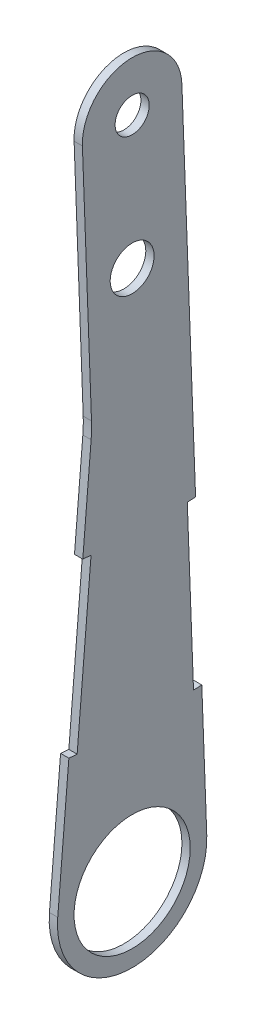
ISO-10303-21;
HEADER;
FILE_DESCRIPTION(('STEP AP214'),'2;1');
FILE_NAME('part.step','',(''),(''),'','','');
FILE_SCHEMA(('AUTOMOTIVE_DESIGN { 1 0 10303 214 1 1 1 1 }'));
ENDSEC;
DATA;
#1=APPLICATION_CONTEXT('core data for automotive mechanical design processes');
#2=APPLICATION_PROTOCOL_DEFINITION('international standard','automotive_design',2000,#1);
#3=PRODUCT_CONTEXT('',#1,'mechanical');
#4=PRODUCT('Part','Part','',(#3));
#5=PRODUCT_RELATED_PRODUCT_CATEGORY('part','',(#4));
#6=PRODUCT_DEFINITION_FORMATION('','',#4);
#7=PRODUCT_DEFINITION_CONTEXT('part definition',#1,'design');
#8=PRODUCT_DEFINITION('design','',#6,#7);
#9=PRODUCT_DEFINITION_SHAPE('','',#8);
#10=(LENGTH_UNIT() NAMED_UNIT(*) SI_UNIT(.MILLI.,.METRE.));
#11=(NAMED_UNIT(*) PLANE_ANGLE_UNIT() SI_UNIT($,.RADIAN.));
#12=(NAMED_UNIT(*) SI_UNIT($,.STERADIAN.) SOLID_ANGLE_UNIT());
#13=UNCERTAINTY_MEASURE_WITH_UNIT(LENGTH_MEASURE(1.E-05),#10,'distance_accuracy_value','');
#14=(GEOMETRIC_REPRESENTATION_CONTEXT(3) GLOBAL_UNCERTAINTY_ASSIGNED_CONTEXT((#13)) GLOBAL_UNIT_ASSIGNED_CONTEXT((#10,
#11,#12)) REPRESENTATION_CONTEXT('',''));
#15=CARTESIAN_POINT('',(0.,0.,0.));
#16=DIRECTION('',(0.,0.,1.));
#17=DIRECTION('',(1.,0.,0.));
#18=AXIS2_PLACEMENT_3D('',#15,#16,#17);
#19=CARTESIAN_POINT('',(1.5875,79.2595794387611,33.1580566897508));
#20=DIRECTION('',(-1.,0.,0.));
#21=DIRECTION('',(0.,0.,1.));
#22=AXIS2_PLACEMENT_3D('',#19,#20,#21);
#23=CYLINDRICAL_SURFACE('',#22,25.4);
#24=CARTESIAN_POINT('',(0.,79.2595794387611,33.1580566897508));
#25=DIRECTION('',(1.,0.,0.));
#26=DIRECTION('',(0.,0.,-1.));
#27=AXIS2_PLACEMENT_3D('',#24,#25,#26);
#28=CIRCLE('',#27,25.4);
#29=CARTESIAN_POINT('',(0.,77.1296906583665,7.84751394995261));
#30=VERTEX_POINT('',#29);
#31=CARTESIAN_POINT('',(0.,80.2120794387611,7.77592234785588));
#32=VERTEX_POINT('',#31);
#33=EDGE_CURVE('E292',#30,#32,#28,.T.);
#34=ORIENTED_EDGE('',*,*,#33,.F.);
#35=DIRECTION('',(-1.,0.,0.));
#36=VECTOR('',#35,1.);
#37=CARTESIAN_POINT('',(1.5875,77.1296906583665,7.84751394995261));
#38=LINE('',#37,#36);
#39=CARTESIAN_POINT('',(1.5875,77.1296906583665,7.84751394995261));
#40=VERTEX_POINT('',#39);
#41=EDGE_CURVE('E12',#40,#30,#38,.T.);
#42=ORIENTED_EDGE('',*,*,#41,.F.);
#43=CARTESIAN_POINT('',(1.5875,79.2595794387611,33.1580566897508));
#44=DIRECTION('',(1.,0.,0.));
#45=DIRECTION('',(0.,0.,-1.));
#46=AXIS2_PLACEMENT_3D('',#43,#44,#45);
#47=CIRCLE('',#46,25.4);
#48=CARTESIAN_POINT('',(1.5875,80.2120794387611,7.77592234785588));
#49=VERTEX_POINT('',#48);
#50=EDGE_CURVE('E237',#40,#49,#47,.T.);
#51=ORIENTED_EDGE('',*,*,#50,.T.);
#52=DIRECTION('',(-1.,0.,0.));
#53=VECTOR('',#52,1.);
#54=CARTESIAN_POINT('',(1.5875,80.2120794387611,7.77592234785588));
#55=LINE('',#54,#53);
#56=EDGE_CURVE('E115',#49,#32,#55,.T.);
#57=ORIENTED_EDGE('',*,*,#56,.T.);
#58=EDGE_LOOP('',(#34,#42,#51,#57));
#59=FACE_BOUND('',#58,.T.);
#60=ADVANCED_FACE('F46',(#59),#23,.F.);
#61=CARTESIAN_POINT('',(1.5875,1.19806243897197,14.2371802911364));
#62=DIRECTION('',(0.,0.0838538889919138,0.996478060621975));
#63=DIRECTION('',(0.,-0.996478060621975,0.0838538889919138));
#64=AXIS2_PLACEMENT_3D('',#61,#62,#63);
#65=PLANE('',#64);
#66=DIRECTION('',(0.,0.996478060621975,-0.0838538889919138));
#67=VECTOR('',#66,1.);
#68=CARTESIAN_POINT('',(0.,1.19806243897197,14.2371802911364));
#69=LINE('',#68,#67);
#70=CARTESIAN_POINT('',(0.,58.1467836035178,9.44493053524856));
#71=VERTEX_POINT('',#70);
#72=EDGE_CURVE('E296',#71,#30,#69,.T.);
#73=ORIENTED_EDGE('',*,*,#72,.F.);
#74=DIRECTION('',(-1.,0.,0.));
#75=VECTOR('',#74,1.);
#76=CARTESIAN_POINT('',(1.5875,58.1467836035178,9.44493053524856));
#77=LINE('',#76,#75);
#78=CARTESIAN_POINT('',(1.5875,58.1467836035178,9.44493053524856));
#79=VERTEX_POINT('',#78);
#80=EDGE_CURVE('E55',#79,#71,#77,.T.);
#81=ORIENTED_EDGE('',*,*,#80,.F.);
#82=DIRECTION('',(0.,0.996478060621975,-0.0838538889919138));
#83=VECTOR('',#82,1.);
#84=CARTESIAN_POINT('',(1.5875,1.19806243897197,14.2371802911364));
#85=LINE('',#84,#83);
#86=EDGE_CURVE('E232',#79,#40,#85,.T.);
#87=ORIENTED_EDGE('',*,*,#86,.T.);
#88=ORIENTED_EDGE('',*,*,#41,.T.);
#89=EDGE_LOOP('',(#73,#81,#87,#88));
#90=FACE_BOUND('',#89,.T.);
#91=ADVANCED_FACE('F285',(#90),#65,.T.);
#92=CARTESIAN_POINT('',(1.5875,56.948721164546,-4.79224975588751));
#93=DIRECTION('',(0.,0.996478060621975,-0.0838538889919072));
#94=DIRECTION('',(0.,0.0838538889919072,0.996478060621975));
#95=AXIS2_PLACEMENT_3D('',#92,#93,#94);
#96=PLANE('',#95);
#97=DIRECTION('',(0.,-0.0838538889919072,-0.996478060621975));
#98=VECTOR('',#97,1.);
#99=CARTESIAN_POINT('',(0.,56.948721164546,-4.79224975588751));
#100=LINE('',#99,#98);
#101=CARTESIAN_POINT('',(0.,58.0136655547432,7.86302161401119));
#102=VERTEX_POINT('',#101);
#103=EDGE_CURVE('E302',#71,#102,#100,.T.);
#104=ORIENTED_EDGE('',*,*,#103,.T.);
#105=DIRECTION('',(-1.,0.,0.));
#106=VECTOR('',#105,1.);
#107=CARTESIAN_POINT('',(1.5875,58.0136655547432,7.86302161401119));
#108=LINE('',#107,#106);
#109=CARTESIAN_POINT('',(1.5875,58.0136655547432,7.86302161401119));
#110=VERTEX_POINT('',#109);
#111=EDGE_CURVE('E378',#110,#102,#108,.T.);
#112=ORIENTED_EDGE('',*,*,#111,.F.);
#113=DIRECTION('',(0.,-0.0838538889919072,-0.996478060621975));
#114=VECTOR('',#113,1.);
#115=CARTESIAN_POINT('',(1.5875,56.948721164546,-4.79224975588751));
#116=LINE('',#115,#114);
#117=EDGE_CURVE('E229',#79,#110,#116,.T.);
#118=ORIENTED_EDGE('',*,*,#117,.F.);
#119=ORIENTED_EDGE('',*,*,#80,.T.);
#120=EDGE_LOOP('',(#104,#112,#118,#119));
#121=FACE_BOUND('',#120,.T.);
#122=ADVANCED_FACE('F289',(#121),#96,.F.);
#123=CARTESIAN_POINT('',(1.5875,1.06494439019731,12.6552713698991));
#124=DIRECTION('',(0.,0.083853888991914,0.996478060621975));
#125=DIRECTION('',(0.,-0.996478060621975,0.083853888991914));
#126=AXIS2_PLACEMENT_3D('',#123,#124,#125);
#127=PLANE('',#126);
#128=DIRECTION('',(0.,0.996478060621975,-0.083853888991914));
#129=VECTOR('',#128,1.);
#130=CARTESIAN_POINT('',(0.,1.06494439019731,12.6552713698991));
#131=LINE('',#130,#129);
#132=CARTESIAN_POINT('',(0.,26.3754871299955,10.5253825895045));
#133=VERTEX_POINT('',#132);
#134=EDGE_CURVE('E307',#133,#102,#131,.T.);
#135=ORIENTED_EDGE('',*,*,#134,.F.);
#136=DIRECTION('',(-1.,0.,0.));
#137=VECTOR('',#136,1.);
#138=CARTESIAN_POINT('',(1.5875,26.3754871299955,10.5253825895045));
#139=LINE('',#138,#137);
#140=CARTESIAN_POINT('',(1.5875,26.3754871299955,10.5253825895045));
#141=VERTEX_POINT('',#140);
#142=EDGE_CURVE('E375',#141,#133,#139,.T.);
#143=ORIENTED_EDGE('',*,*,#142,.F.);
#144=DIRECTION('',(0.,0.996478060621975,-0.083853888991914));
#145=VECTOR('',#144,1.);
#146=CARTESIAN_POINT('',(1.5875,1.06494439019731,12.6552713698991));
#147=LINE('',#146,#145);
#148=EDGE_CURVE('E221',#141,#110,#147,.T.);
#149=ORIENTED_EDGE('',*,*,#148,.T.);
#150=ORIENTED_EDGE('',*,*,#111,.T.);
#151=EDGE_LOOP('',(#135,#143,#149,#150));
#152=FACE_BOUND('',#151,.T.);
#153=ADVANCED_FACE('F391',(#152),#127,.T.);
#154=CARTESIAN_POINT('',(1.5875,25.3105427397981,-2.12988878039471));
#155=DIRECTION('',(0.,0.996478060621974,-0.0838538889919179));
#156=DIRECTION('',(0.,0.0838538889919179,0.996478060621975));
#157=AXIS2_PLACEMENT_3D('',#154,#155,#156);
#158=PLANE('',#157);
#159=DIRECTION('',(0.,-0.0838538889919179,-0.996478060621975));
#160=VECTOR('',#159,1.);
#161=CARTESIAN_POINT('',(0.,25.3105427397981,-2.12988878039471));
#162=LINE('',#161,#160);
#163=CARTESIAN_POINT('',(0.,26.5086051787701,12.1072915107418));
#164=VERTEX_POINT('',#163);
#165=EDGE_CURVE('E312',#164,#133,#162,.T.);
#166=ORIENTED_EDGE('',*,*,#165,.F.);
#167=DIRECTION('',(-1.,0.,0.));
#168=VECTOR('',#167,1.);
#169=CARTESIAN_POINT('',(1.5875,26.5086051787701,12.1072915107418));
#170=LINE('',#169,#168);
#171=CARTESIAN_POINT('',(1.5875,26.5086051787701,12.1072915107418));
#172=VERTEX_POINT('',#171);
#173=EDGE_CURVE('E372',#172,#164,#170,.T.);
#174=ORIENTED_EDGE('',*,*,#173,.F.);
#175=DIRECTION('',(0.,-0.0838538889919179,-0.996478060621975));
#176=VECTOR('',#175,1.);
#177=CARTESIAN_POINT('',(1.5875,25.3105427397981,-2.12988878039471));
#178=LINE('',#177,#176);
#179=EDGE_CURVE('E216',#172,#141,#178,.T.);
#180=ORIENTED_EDGE('',*,*,#179,.T.);
#181=ORIENTED_EDGE('',*,*,#142,.T.);
#182=EDGE_LOOP('',(#166,#174,#180,#181));
#183=FACE_BOUND('',#182,.T.);
#184=ADVANCED_FACE('F466',(#183),#158,.T.);
#185=CARTESIAN_POINT('',(1.5875,1.19806243897197,14.2371802911365));
#186=DIRECTION('',(0.,-0.0838538889919142,-0.996478060621975));
#187=DIRECTION('',(0.,0.996478060621975,-0.0838538889919142));
#188=AXIS2_PLACEMENT_3D('',#185,#186,#187);
#189=PLANE('',#188);
#190=DIRECTION('',(0.,-0.996478060621975,0.0838538889919142));
#191=VECTOR('',#190,1.);
#192=CARTESIAN_POINT('',(0.,1.19806243897197,14.2371802911365));
#193=LINE('',#192,#191);
#194=CARTESIAN_POINT('',(0.,1.19806243897197,14.2371802911365));
#195=VERTEX_POINT('',#194);
#196=EDGE_CURVE('E316',#164,#195,#193,.T.);
#197=ORIENTED_EDGE('',*,*,#196,.T.);
#198=DIRECTION('',(-1.,0.,0.));
#199=VECTOR('',#198,1.);
#200=CARTESIAN_POINT('',(1.5875,1.19806243897197,14.2371802911365));
#201=LINE('',#200,#199);
#202=CARTESIAN_POINT('',(1.5875,1.19806243897197,14.2371802911365));
#203=VERTEX_POINT('',#202);
#204=EDGE_CURVE('E368',#203,#195,#201,.T.);
#205=ORIENTED_EDGE('',*,*,#204,.F.);
#206=DIRECTION('',(0.,-0.996478060621975,0.0838538889919142));
#207=VECTOR('',#206,1.);
#208=CARTESIAN_POINT('',(1.5875,1.19806243897197,14.2371802911365));
#209=LINE('',#208,#207);
#210=EDGE_CURVE('E212',#172,#203,#209,.T.);
#211=ORIENTED_EDGE('',*,*,#210,.F.);
#212=ORIENTED_EDGE('',*,*,#173,.T.);
#213=EDGE_LOOP('',(#197,#205,#211,#212));
#214=FACE_BOUND('',#213,.T.);
#215=ADVANCED_FACE('F462',(#214),#189,.F.);
#216=CARTESIAN_POINT('',(1.5875,0.,0.));
#217=DIRECTION('',(-1.,0.,0.));
#218=DIRECTION('',(0.,0.,1.));
#219=AXIS2_PLACEMENT_3D('',#216,#217,#218);
#220=CYLINDRICAL_SURFACE('',#219,14.2875);
#221=CARTESIAN_POINT('',(0.,0.,0.));
#222=DIRECTION('',(1.,0.,0.));
#223=DIRECTION('',(0.,0.,-1.));
#224=AXIS2_PLACEMENT_3D('',#221,#222,#223);
#225=CIRCLE('',#224,14.2875);
#226=CARTESIAN_POINT('',(0.,0.535781250000005,-14.2774505673159));
#227=VERTEX_POINT('',#226);
#228=EDGE_CURVE('E319',#195,#227,#225,.T.);
#229=ORIENTED_EDGE('',*,*,#228,.T.);
#230=DIRECTION('',(-1.,0.,0.));
#231=VECTOR('',#230,1.);
#232=CARTESIAN_POINT('',(1.5875,0.535781250000005,-14.2774505673159));
#233=LINE('',#232,#231);
#234=CARTESIAN_POINT('',(1.5875,0.535781250000005,-14.2774505673159));
#235=VERTEX_POINT('',#234);
#236=EDGE_CURVE('E365',#235,#227,#233,.T.);
#237=ORIENTED_EDGE('',*,*,#236,.F.);
#238=CARTESIAN_POINT('',(1.5875,0.,0.));
#239=DIRECTION('',(1.,0.,0.));
#240=DIRECTION('',(0.,0.,-1.));
#241=AXIS2_PLACEMENT_3D('',#238,#239,#240);
#242=CIRCLE('',#241,14.2875);
#243=EDGE_CURVE('E209',#203,#235,#242,.T.);
#244=ORIENTED_EDGE('',*,*,#243,.F.);
#245=ORIENTED_EDGE('',*,*,#204,.T.);
#246=EDGE_LOOP('',(#229,#237,#244,#245));
#247=FACE_BOUND('',#246,.T.);
#248=ADVANCED_FACE('F459',(#247),#220,.T.);
#249=CARTESIAN_POINT('',(1.5875,0.535781250000008,-14.2774505673159));
#250=DIRECTION('',(0.,0.0375000000000005,-0.999296627633657));
#251=DIRECTION('',(0.,0.999296627633657,0.0375000000000006));
#252=AXIS2_PLACEMENT_3D('',#249,#250,#251);
#253=PLANE('',#252);
#254=DIRECTION('',(0.,-0.999296627633657,-0.0375000000000006));
#255=VECTOR('',#254,1.);
#256=CARTESIAN_POINT('',(0.,0.535781250000008,-14.2774505673159));
#257=LINE('',#256,#255);
#258=CARTESIAN_POINT('',(0.,25.9179155918949,-13.3249505673159));
#259=VERTEX_POINT('',#258);
#260=EDGE_CURVE('E323',#259,#227,#257,.T.);
#261=ORIENTED_EDGE('',*,*,#260,.F.);
#262=DIRECTION('',(-1.,0.,0.));
#263=VECTOR('',#262,1.);
#264=CARTESIAN_POINT('',(1.5875,25.9179155918949,-13.3249505673159));
#265=LINE('',#264,#263);
#266=CARTESIAN_POINT('',(1.5875,25.9179155918949,-13.3249505673159));
#267=VERTEX_POINT('',#266);
#268=EDGE_CURVE('E362',#267,#259,#265,.T.);
#269=ORIENTED_EDGE('',*,*,#268,.F.);
#270=DIRECTION('',(0.,-0.999296627633657,-0.0375000000000006));
#271=VECTOR('',#270,1.);
#272=CARTESIAN_POINT('',(1.5875,0.535781250000008,-14.2774505673159));
#273=LINE('',#272,#271);
#274=EDGE_CURVE('E201',#267,#235,#273,.T.);
#275=ORIENTED_EDGE('',*,*,#274,.T.);
#276=ORIENTED_EDGE('',*,*,#236,.T.);
#277=EDGE_LOOP('',(#261,#269,#275,#276));
#278=FACE_BOUND('',#277,.T.);
#279=ADVANCED_FACE('F423',(#278),#253,.T.);
#280=CARTESIAN_POINT('',(1.5875,25.3821343418949,0.952499999999966));
#281=DIRECTION('',(0.,0.999296627633657,0.0374999999999986));
#282=DIRECTION('',(0.,-0.0374999999999986,0.999296627633657));
#283=AXIS2_PLACEMENT_3D('',#280,#281,#282);
#284=PLANE('',#283);
#285=DIRECTION('',(0.,0.0374999999999986,-0.999296627633657));
#286=VECTOR('',#285,1.);
#287=CARTESIAN_POINT('',(0.,25.3821343418949,0.952499999999966));
#288=LINE('',#287,#286);
#289=CARTESIAN_POINT('',(0.,25.8583843418949,-11.7385671709474));
#290=VERTEX_POINT('',#289);
#291=EDGE_CURVE('E327',#290,#259,#288,.T.);
#292=ORIENTED_EDGE('',*,*,#291,.F.);
#293=DIRECTION('',(-1.,0.,0.));
#294=VECTOR('',#293,1.);
#295=CARTESIAN_POINT('',(1.5875,25.8583843418949,-11.7385671709474));
#296=LINE('',#295,#294);
#297=CARTESIAN_POINT('',(1.5875,25.8583843418949,-11.7385671709474));
#298=VERTEX_POINT('',#297);
#299=EDGE_CURVE('E359',#298,#290,#296,.T.);
#300=ORIENTED_EDGE('',*,*,#299,.F.);
#301=DIRECTION('',(0.,0.0374999999999986,-0.999296627633657));
#302=VECTOR('',#301,1.);
#303=CARTESIAN_POINT('',(1.5875,25.3821343418949,0.952499999999966));
#304=LINE('',#303,#302);
#305=EDGE_CURVE('E196',#298,#267,#304,.T.);
#306=ORIENTED_EDGE('',*,*,#305,.T.);
#307=ORIENTED_EDGE('',*,*,#268,.T.);
#308=EDGE_LOOP('',(#292,#300,#306,#307));
#309=FACE_BOUND('',#308,.T.);
#310=ADVANCED_FACE('F429',(#309),#284,.T.);
#311=CARTESIAN_POINT('',(1.5875,0.476250000000002,-12.6910671709474));
#312=DIRECTION('',(0.,-0.0375000000000002,0.999296627633657));
#313=DIRECTION('',(0.,-0.999296627633657,-0.0375000000000002));
#314=AXIS2_PLACEMENT_3D('',#311,#312,#313);
#315=PLANE('',#314);
#316=DIRECTION('',(0.,0.999296627633657,0.0375000000000002));
#317=VECTOR('',#316,1.);
#318=CARTESIAN_POINT('',(0.,0.476250000000002,-12.6910671709474));
#319=LINE('',#318,#317);
#320=CARTESIAN_POINT('',(0.,57.5860522692635,-10.5479421709474));
#321=VERTEX_POINT('',#320);
#322=EDGE_CURVE('E331',#290,#321,#319,.T.);
#323=ORIENTED_EDGE('',*,*,#322,.T.);
#324=DIRECTION('',(-1.,0.,0.));
#325=VECTOR('',#324,1.);
#326=CARTESIAN_POINT('',(1.5875,57.5860522692635,-10.5479421709474));
#327=LINE('',#326,#325);
#328=CARTESIAN_POINT('',(1.5875,57.5860522692635,-10.5479421709474));
#329=VERTEX_POINT('',#328);
#330=EDGE_CURVE('E355',#329,#321,#327,.T.);
#331=ORIENTED_EDGE('',*,*,#330,.F.);
#332=DIRECTION('',(0.,0.999296627633657,0.0375000000000002));
#333=VECTOR('',#332,1.);
#334=CARTESIAN_POINT('',(1.5875,0.476250000000002,-12.6910671709474));
#335=LINE('',#334,#333);
#336=EDGE_CURVE('E192',#298,#329,#335,.T.);
#337=ORIENTED_EDGE('',*,*,#336,.F.);
#338=ORIENTED_EDGE('',*,*,#299,.T.);
#339=EDGE_LOOP('',(#323,#331,#337,#338));
#340=FACE_BOUND('',#339,.T.);
#341=ADVANCED_FACE('F434',(#340),#315,.F.);
#342=CARTESIAN_POINT('',(1.5875,57.1098022692634,2.1431250000003));
#343=DIRECTION('',(0.,0.999296627633657,0.0375000000000052));
#344=DIRECTION('',(0.,-0.0375000000000053,0.999296627633657));
#345=AXIS2_PLACEMENT_3D('',#342,#343,#344);
#346=PLANE('',#345);
#347=DIRECTION('',(0.,0.0375000000000053,-0.999296627633657));
#348=VECTOR('',#347,1.);
#349=CARTESIAN_POINT('',(0.,57.1098022692634,2.1431250000003));
#350=LINE('',#349,#348);
#351=CARTESIAN_POINT('',(0.,57.6455835192635,-12.1343255673159));
#352=VERTEX_POINT('',#351);
#353=EDGE_CURVE('E334',#321,#352,#350,.T.);
#354=ORIENTED_EDGE('',*,*,#353,.T.);
#355=DIRECTION('',(-1.,0.,0.));
#356=VECTOR('',#355,1.);
#357=CARTESIAN_POINT('',(1.5875,57.6455835192635,-12.1343255673159));
#358=LINE('',#357,#356);
#359=CARTESIAN_POINT('',(1.5875,57.6455835192635,-12.1343255673159));
#360=VERTEX_POINT('',#359);
#361=EDGE_CURVE('E163',#360,#352,#358,.T.);
#362=ORIENTED_EDGE('',*,*,#361,.F.);
#363=DIRECTION('',(0.,0.0375000000000053,-0.999296627633657));
#364=VECTOR('',#363,1.);
#365=CARTESIAN_POINT('',(1.5875,57.1098022692634,2.1431250000003));
#366=LINE('',#365,#364);
#367=EDGE_CURVE('E169',#329,#360,#366,.T.);
#368=ORIENTED_EDGE('',*,*,#367,.F.);
#369=ORIENTED_EDGE('',*,*,#330,.T.);
#370=EDGE_LOOP('',(#354,#362,#368,#369));
#371=FACE_BOUND('',#370,.T.);
#372=ADVANCED_FACE('F437',(#371),#346,.F.);
#373=CARTESIAN_POINT('',(1.5875,0.535781250000005,-14.2774505673159));
#374=DIRECTION('',(0.,0.0375000000000003,-0.999296627633657));
#375=DIRECTION('',(0.,0.999296627633657,0.0375000000000004));
#376=AXIS2_PLACEMENT_3D('',#373,#374,#375);
#377=PLANE('',#376);
#378=DIRECTION('',(0.,-0.999296627633657,-0.0375000000000004));
#379=VECTOR('',#378,1.);
#380=CARTESIAN_POINT('',(0.,0.535781250000005,-14.2774505673159));
#381=LINE('',#380,#379);
#382=CARTESIAN_POINT('',(0.,127.3571875,-9.51830037821054));
#383=VERTEX_POINT('',#382);
#384=EDGE_CURVE('E157',#383,#352,#381,.T.);
#385=ORIENTED_EDGE('',*,*,#384,.F.);
#386=DIRECTION('',(-1.,0.,0.));
#387=VECTOR('',#386,1.);
#388=CARTESIAN_POINT('',(1.5875,127.3571875,-9.51830037821054));
#389=LINE('',#388,#387);
#390=CARTESIAN_POINT('',(1.5875,127.3571875,-9.51830037821054));
#391=VERTEX_POINT('',#390);
#392=EDGE_CURVE('E152',#391,#383,#389,.T.);
#393=ORIENTED_EDGE('',*,*,#392,.F.);
#394=DIRECTION('',(0.,-0.999296627633657,-0.0375000000000004));
#395=VECTOR('',#394,1.);
#396=CARTESIAN_POINT('',(1.5875,0.535781250000005,-14.2774505673159));
#397=LINE('',#396,#395);
#398=EDGE_CURVE('E155',#391,#360,#397,.T.);
#399=ORIENTED_EDGE('',*,*,#398,.T.);
#400=ORIENTED_EDGE('',*,*,#361,.T.);
#401=EDGE_LOOP('',(#385,#393,#399,#400));
#402=FACE_BOUND('',#401,.T.);
#403=ADVANCED_FACE('F154',(#402),#377,.T.);
#404=CARTESIAN_POINT('',(1.5875,127.,0.));
#405=DIRECTION('',(-1.,0.,0.));
#406=DIRECTION('',(0.,0.,1.));
#407=AXIS2_PLACEMENT_3D('',#404,#405,#406);
#408=CYLINDRICAL_SURFACE('',#407,9.525);
#409=CARTESIAN_POINT('',(0.,127.,0.));
#410=DIRECTION('',(1.,0.,0.));
#411=DIRECTION('',(0.,0.,-1.));
#412=AXIS2_PLACEMENT_3D('',#409,#410,#411);
#413=CIRCLE('',#412,9.525);
#414=CARTESIAN_POINT('',(0.,126.6428125,9.51830037821063));
#415=VERTEX_POINT('',#414);
#416=EDGE_CURVE('E340',#415,#383,#413,.F.);
#417=ORIENTED_EDGE('',*,*,#416,.F.);
#418=DIRECTION('',(-1.,0.,0.));
#419=VECTOR('',#418,1.);
#420=CARTESIAN_POINT('',(1.5875,126.6428125,9.51830037821063));
#421=LINE('',#420,#419);
#422=CARTESIAN_POINT('',(1.5875,126.6428125,9.51830037821063));
#423=VERTEX_POINT('',#422);
#424=EDGE_CURVE('E108',#423,#415,#421,.T.);
#425=ORIENTED_EDGE('',*,*,#424,.F.);
#426=CARTESIAN_POINT('',(1.5875,127.,0.));
#427=DIRECTION('',(1.,0.,0.));
#428=DIRECTION('',(0.,0.,-1.));
#429=AXIS2_PLACEMENT_3D('',#426,#427,#428);
#430=CIRCLE('',#429,9.525);
#431=EDGE_CURVE('E167',#423,#391,#430,.F.);
#432=ORIENTED_EDGE('',*,*,#431,.T.);
#433=ORIENTED_EDGE('',*,*,#392,.T.);
#434=EDGE_LOOP('',(#417,#425,#432,#433));
#435=FACE_BOUND('',#434,.T.);
#436=ADVANCED_FACE('F173',(#435),#408,.T.);
#437=CARTESIAN_POINT('',(1.5875,-0.178593750000002,4.75915018910529));
#438=DIRECTION('',(0.,0.0375000000000003,-0.999296627633657));
#439=DIRECTION('',(0.,0.999296627633657,0.0375000000000003));
#440=AXIS2_PLACEMENT_3D('',#437,#438,#439);
#441=PLANE('',#440);
#442=DIRECTION('',(0.,-0.999296627633657,-0.0375000000000003));
#443=VECTOR('',#442,1.);
#444=CARTESIAN_POINT('',(0.,-0.178593750000002,4.75915018910529));
#445=LINE('',#444,#443);
#446=EDGE_CURVE('E343',#415,#32,#445,.T.);
#447=ORIENTED_EDGE('',*,*,#446,.T.);
#448=ORIENTED_EDGE('',*,*,#56,.F.);
#449=DIRECTION('',(0.,-0.999296627633657,-0.0375000000000003));
#450=VECTOR('',#449,1.);
#451=CARTESIAN_POINT('',(1.5875,-0.178593750000002,4.75915018910529));
#452=LINE('',#451,#450);
#453=EDGE_CURVE('E63',#423,#49,#452,.T.);
#454=ORIENTED_EDGE('',*,*,#453,.F.);
#455=ORIENTED_EDGE('',*,*,#424,.T.);
#456=EDGE_LOOP('',(#447,#448,#454,#455));
#457=FACE_BOUND('',#456,.T.);
#458=ADVANCED_FACE('F438',(#457),#441,.F.);
#459=CARTESIAN_POINT('',(1.5875,0.,0.));
#460=DIRECTION('',(-1.,0.,0.));
#461=DIRECTION('',(0.,0.,1.));
#462=AXIS2_PLACEMENT_3D('',#459,#460,#461);
#463=CYLINDRICAL_SURFACE('',#462,11.1125);
#464=CARTESIAN_POINT('',(1.5875,0.,0.));
#465=DIRECTION('',(1.,0.,0.));
#466=DIRECTION('',(0.,0.,-1.));
#467=AXIS2_PLACEMENT_3D('',#464,#465,#466);
#468=CIRCLE('',#467,11.1125);
#469=CARTESIAN_POINT('',(1.5875,0.,-11.1125));
#470=VERTEX_POINT('',#469);
#471=EDGE_CURVE('E178',#470,#470,#468,.T.);
#472=ORIENTED_EDGE('',*,*,#471,.T.);
#473=EDGE_LOOP('',(#472));
#474=FACE_BOUND('',#473,.T.);
#475=CARTESIAN_POINT('',(0.,0.,0.));
#476=DIRECTION('',(1.,0.,0.));
#477=DIRECTION('',(0.,0.,-1.));
#478=AXIS2_PLACEMENT_3D('',#475,#476,#477);
#479=CIRCLE('',#478,11.1125);
#480=CARTESIAN_POINT('',(0.,0.,-11.1125));
#481=VERTEX_POINT('',#480);
#482=EDGE_CURVE('E241',#481,#481,#479,.T.);
#483=ORIENTED_EDGE('',*,*,#482,.F.);
#484=EDGE_LOOP('',(#483));
#485=FACE_BOUND('',#484,.T.);
#486=ADVANCED_FACE('F267',(#474,#485),#463,.F.);
#487=CARTESIAN_POINT('',(1.5875,0.,0.));
#488=DIRECTION('',(1.,0.,0.));
#489=DIRECTION('',(0.,0.,-1.));
#490=AXIS2_PLACEMENT_3D('',#487,#488,#489);
#491=PLANE('',#490);
#492=CARTESIAN_POINT('',(1.5875,101.6,0.));
#493=DIRECTION('',(1.,0.,0.));
#494=DIRECTION('',(0.,0.,-1.));
#495=AXIS2_PLACEMENT_3D('',#492,#493,#494);
#496=CIRCLE('',#495,4.2);
#497=CARTESIAN_POINT('',(1.5875,101.6,-4.19999999999994));
#498=VERTEX_POINT('',#497);
#499=EDGE_CURVE('E255',#498,#498,#496,.T.);
#500=ORIENTED_EDGE('',*,*,#499,.F.);
#501=EDGE_LOOP('',(#500));
#502=FACE_BOUND('',#501,.T.);
#503=CARTESIAN_POINT('',(1.5875,127.,0.));
#504=DIRECTION('',(1.,0.,0.));
#505=DIRECTION('',(0.,0.,-1.));
#506=AXIS2_PLACEMENT_3D('',#503,#504,#505);
#507=CIRCLE('',#506,3.26389999999999);
#508=CARTESIAN_POINT('',(1.5875,127.,-3.26389999999996));
#509=VERTEX_POINT('',#508);
#510=EDGE_CURVE('E247',#509,#509,#507,.T.);
#511=ORIENTED_EDGE('',*,*,#510,.F.);
#512=EDGE_LOOP('',(#511));
#513=FACE_BOUND('',#512,.T.);
#514=ORIENTED_EDGE('',*,*,#50,.F.);
#515=ORIENTED_EDGE('',*,*,#86,.F.);
#516=ORIENTED_EDGE('',*,*,#117,.T.);
#517=ORIENTED_EDGE('',*,*,#148,.F.);
#518=ORIENTED_EDGE('',*,*,#179,.F.);
#519=ORIENTED_EDGE('',*,*,#210,.T.);
#520=ORIENTED_EDGE('',*,*,#243,.T.);
#521=ORIENTED_EDGE('',*,*,#274,.F.);
#522=ORIENTED_EDGE('',*,*,#305,.F.);
#523=ORIENTED_EDGE('',*,*,#336,.T.);
#524=ORIENTED_EDGE('',*,*,#367,.T.);
#525=ORIENTED_EDGE('',*,*,#398,.F.);
#526=ORIENTED_EDGE('',*,*,#431,.F.);
#527=ORIENTED_EDGE('',*,*,#453,.T.);
#528=EDGE_LOOP('',(#514,#515,#516,#517,#518,#519,#520,#521,#522,#523,#524,#525,#526,#527));
#529=FACE_BOUND('',#528,.T.);
#530=ORIENTED_EDGE('',*,*,#471,.F.);
#531=EDGE_LOOP('',(#530));
#532=FACE_BOUND('',#531,.T.);
#533=ADVANCED_FACE('F165',(#502,#513,#529,#532),#491,.T.);
#534=CARTESIAN_POINT('',(0.,0.,0.));
#535=DIRECTION('',(1.,0.,0.));
#536=DIRECTION('',(0.,0.,-1.));
#537=AXIS2_PLACEMENT_3D('',#534,#535,#536);
#538=PLANE('',#537);
#539=CARTESIAN_POINT('',(0.,101.6,0.));
#540=DIRECTION('',(1.,0.,0.));
#541=DIRECTION('',(0.,0.,-1.));
#542=AXIS2_PLACEMENT_3D('',#539,#540,#541);
#543=CIRCLE('',#542,4.2);
#544=CARTESIAN_POINT('',(0.,101.6,-4.19999999999994));
#545=VERTEX_POINT('',#544);
#546=EDGE_CURVE('E252',#545,#545,#543,.T.);
#547=ORIENTED_EDGE('',*,*,#546,.T.);
#548=EDGE_LOOP('',(#547));
#549=FACE_BOUND('',#548,.T.);
#550=CARTESIAN_POINT('',(0.,127.,0.));
#551=DIRECTION('',(1.,0.,0.));
#552=DIRECTION('',(0.,0.,-1.));
#553=AXIS2_PLACEMENT_3D('',#550,#551,#552);
#554=CIRCLE('',#553,3.26390000000001);
#555=CARTESIAN_POINT('',(0.,127.,-3.26389999999999));
#556=VERTEX_POINT('',#555);
#557=EDGE_CURVE('E242',#556,#556,#554,.T.);
#558=ORIENTED_EDGE('',*,*,#557,.T.);
#559=EDGE_LOOP('',(#558));
#560=FACE_BOUND('',#559,.T.);
#561=ORIENTED_EDGE('',*,*,#33,.T.);
#562=ORIENTED_EDGE('',*,*,#446,.F.);
#563=ORIENTED_EDGE('',*,*,#416,.T.);
#564=ORIENTED_EDGE('',*,*,#384,.T.);
#565=ORIENTED_EDGE('',*,*,#353,.F.);
#566=ORIENTED_EDGE('',*,*,#322,.F.);
#567=ORIENTED_EDGE('',*,*,#291,.T.);
#568=ORIENTED_EDGE('',*,*,#260,.T.);
#569=ORIENTED_EDGE('',*,*,#228,.F.);
#570=ORIENTED_EDGE('',*,*,#196,.F.);
#571=ORIENTED_EDGE('',*,*,#165,.T.);
#572=ORIENTED_EDGE('',*,*,#134,.T.);
#573=ORIENTED_EDGE('',*,*,#103,.F.);
#574=ORIENTED_EDGE('',*,*,#72,.T.);
#575=EDGE_LOOP('',(#561,#562,#563,#564,#565,#566,#567,#568,#569,#570,#571,#572,#573,#574));
#576=FACE_BOUND('',#575,.T.);
#577=ORIENTED_EDGE('',*,*,#482,.T.);
#578=EDGE_LOOP('',(#577));
#579=FACE_BOUND('',#578,.T.);
#580=ADVANCED_FACE('F266',(#549,#560,#576,#579),#538,.F.);
#581=CARTESIAN_POINT('',(1.5875,127.,0.));
#582=DIRECTION('',(1.,0.,0.));
#583=DIRECTION('',(0.,0.,-1.));
#584=AXIS2_PLACEMENT_3D('',#581,#582,#583);
#585=CYLINDRICAL_SURFACE('',#584,3.2639);
#586=ORIENTED_EDGE('',*,*,#557,.F.);
#587=EDGE_LOOP('',(#586));
#588=FACE_BOUND('',#587,.T.);
#589=ORIENTED_EDGE('',*,*,#510,.T.);
#590=EDGE_LOOP('',(#589));
#591=FACE_BOUND('',#590,.T.);
#592=ADVANCED_FACE('F271',(#588,#591),#585,.F.);
#593=CARTESIAN_POINT('',(1.5875,101.6,0.));
#594=DIRECTION('',(1.,0.,0.));
#595=DIRECTION('',(0.,0.,-1.));
#596=AXIS2_PLACEMENT_3D('',#593,#594,#595);
#597=CYLINDRICAL_SURFACE('',#596,4.2);
#598=ORIENTED_EDGE('',*,*,#546,.F.);
#599=EDGE_LOOP('',(#598));
#600=FACE_BOUND('',#599,.T.);
#601=ORIENTED_EDGE('',*,*,#499,.T.);
#602=EDGE_LOOP('',(#601));
#603=FACE_BOUND('',#602,.T.);
#604=ADVANCED_FACE('F262',(#600,#603),#597,.F.);
#605=CLOSED_SHELL('',(#60,#91,#122,#153,#184,#215,#248,#279,#310,#341,#372,#403,#436,#458,#486,
#533,#580,#592,#604));
#606=MANIFOLD_SOLID_BREP('B2',#605);
#607=ADVANCED_BREP_SHAPE_REPRESENTATION('',(#18,#606),#14);
#608=SHAPE_DEFINITION_REPRESENTATION(#9,#607);
ENDSEC;
END-ISO-10303-21;
